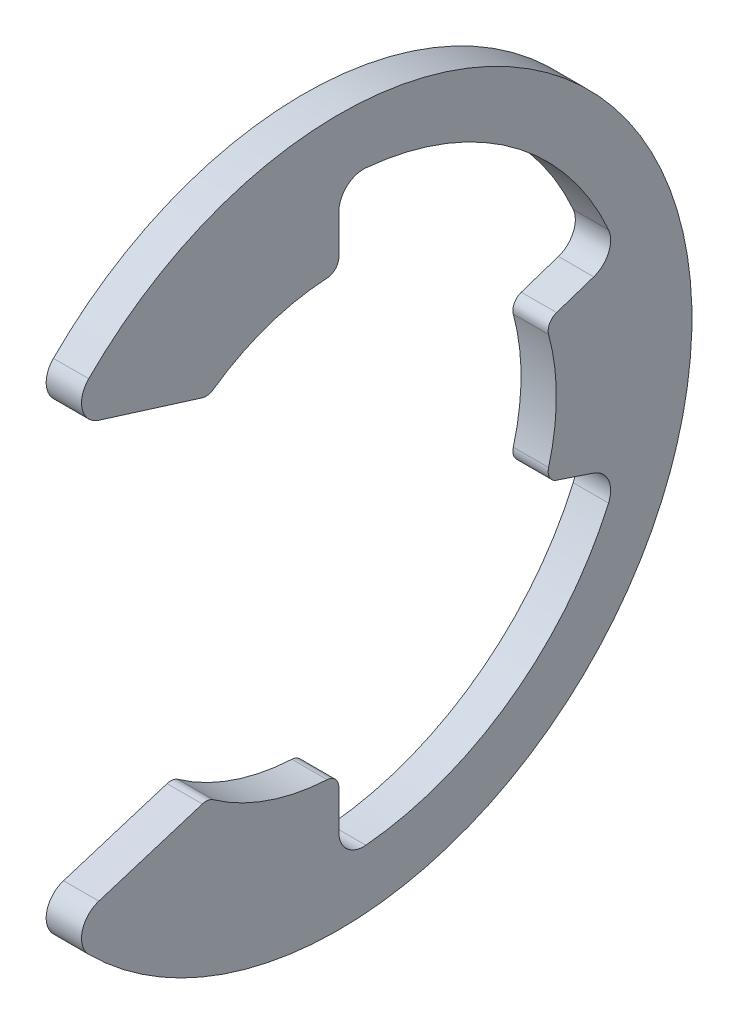
ISO-10303-21;
HEADER;
FILE_DESCRIPTION(('STEP AP214'),'2;1');
FILE_NAME('part.step','',(''),(''),'','','');
FILE_SCHEMA(('AUTOMOTIVE_DESIGN { 1 0 10303 214 1 1 1 1 }'));
ENDSEC;
DATA;
#1=APPLICATION_CONTEXT('core data for automotive mechanical design processes');
#2=APPLICATION_PROTOCOL_DEFINITION('international standard','automotive_design',2000,#1);
#3=PRODUCT_CONTEXT('',#1,'mechanical');
#4=PRODUCT('Part','Part','',(#3));
#5=PRODUCT_RELATED_PRODUCT_CATEGORY('part','',(#4));
#6=PRODUCT_DEFINITION_FORMATION('','',#4);
#7=PRODUCT_DEFINITION_CONTEXT('part definition',#1,'design');
#8=PRODUCT_DEFINITION('design','',#6,#7);
#9=PRODUCT_DEFINITION_SHAPE('','',#8);
#10=(LENGTH_UNIT() NAMED_UNIT(*) SI_UNIT(.MILLI.,.METRE.));
#11=(NAMED_UNIT(*) PLANE_ANGLE_UNIT() SI_UNIT($,.RADIAN.));
#12=(NAMED_UNIT(*) SI_UNIT($,.STERADIAN.) SOLID_ANGLE_UNIT());
#13=UNCERTAINTY_MEASURE_WITH_UNIT(LENGTH_MEASURE(1.E-05),#10,'distance_accuracy_value','');
#14=(GEOMETRIC_REPRESENTATION_CONTEXT(3) GLOBAL_UNCERTAINTY_ASSIGNED_CONTEXT((#13)) GLOBAL_UNIT_ASSIGNED_CONTEXT((#10,
#11,#12)) REPRESENTATION_CONTEXT('',''));
#15=CARTESIAN_POINT('',(0.,0.,0.));
#16=DIRECTION('',(0.,0.,1.));
#17=DIRECTION('',(1.,0.,0.));
#18=AXIS2_PLACEMENT_3D('',#15,#16,#17);
#19=CARTESIAN_POINT('',(0.634999999999999,0.,0.));
#20=DIRECTION('',(-1.,0.,0.));
#21=DIRECTION('',(0.,0.,1.));
#22=AXIS2_PLACEMENT_3D('',#19,#20,#21);
#23=CYLINDRICAL_SURFACE('',#22,7.8232);
#24=CARTESIAN_POINT('',(0.634999999999999,0.,0.));
#25=DIRECTION('',(-1.,0.,0.));
#26=DIRECTION('',(0.,0.,-1.));
#27=AXIS2_PLACEMENT_3D('',#24,#25,#26);
#28=CIRCLE('',#27,7.8232);
#29=CARTESIAN_POINT('',(0.634999999999999,2.0713168041031,-7.54401119677324));
#30=VERTEX_POINT('',#29);
#31=CARTESIAN_POINT('',(0.634999999999999,-2.0713168041031,-7.54401119677324));
#32=VERTEX_POINT('',#31);
#33=EDGE_CURVE('E241',#30,#32,#28,.T.);
#34=ORIENTED_EDGE('',*,*,#33,.F.);
#35=DIRECTION('',(-1.,0.,0.));
#36=VECTOR('',#35,1.);
#37=CARTESIAN_POINT('',(0.634999999999999,2.0713168041031,-7.54401119677324));
#38=LINE('',#37,#36);
#39=CARTESIAN_POINT('',(-0.635000000000002,2.0713168041031,-7.54401119677324));
#40=VERTEX_POINT('',#39);
#41=EDGE_CURVE('E355',#30,#40,#38,.T.);
#42=ORIENTED_EDGE('',*,*,#41,.T.);
#43=CARTESIAN_POINT('',(-0.635000000000002,0.,0.));
#44=DIRECTION('',(-1.,0.,0.));
#45=DIRECTION('',(0.,0.,-1.));
#46=AXIS2_PLACEMENT_3D('',#43,#44,#45);
#47=CIRCLE('',#46,7.8232);
#48=CARTESIAN_POINT('',(-0.635000000000002,-2.0713168041031,-7.54401119677324));
#49=VERTEX_POINT('',#48);
#50=EDGE_CURVE('E414',#40,#49,#47,.T.);
#51=ORIENTED_EDGE('',*,*,#50,.T.);
#52=DIRECTION('',(-1.,0.,0.));
#53=VECTOR('',#52,1.);
#54=CARTESIAN_POINT('',(0.634999999999999,-2.0713168041031,-7.54401119677324));
#55=LINE('',#54,#53);
#56=EDGE_CURVE('E55',#49,#32,#55,.F.);
#57=ORIENTED_EDGE('',*,*,#56,.T.);
#58=EDGE_LOOP('',(#34,#42,#51,#57));
#59=FACE_BOUND('',#58,.T.);
#60=ADVANCED_FACE('F32',(#59),#23,.F.);
#61=CARTESIAN_POINT('',(0.634999999999999,-2.47391305910293,-7.42173917730878));
#62=DIRECTION('',(0.,0.948683298050514,-0.316227766016838));
#63=DIRECTION('',(0.,0.316227766016838,0.948683298050514));
#64=AXIS2_PLACEMENT_3D('',#61,#62,#63);
#65=PLANE('',#64);
#66=DIRECTION('',(0.,-0.316227766016838,-0.948683298050514));
#67=VECTOR('',#66,1.);
#68=CARTESIAN_POINT('',(0.634999999999999,-2.47391305910293,-7.42173917730878));
#69=LINE('',#68,#67);
#70=CARTESIAN_POINT('',(0.634999999999999,-2.61069498486514,-7.83208495459542));
#71=VERTEX_POINT('',#70);
#72=CARTESIAN_POINT('',(0.634999999999999,-3.05564899135356,-9.16694697406069));
#73=VERTEX_POINT('',#72);
#74=EDGE_CURVE('E243',#71,#73,#69,.T.);
#75=ORIENTED_EDGE('',*,*,#74,.F.);
#76=DIRECTION('',(-1.,0.,0.));
#77=VECTOR('',#76,1.);
#78=CARTESIAN_POINT('',(0.634999999999999,-2.61069498486514,-7.83208495459542));
#79=LINE('',#78,#77);
#80=CARTESIAN_POINT('',(-0.635000000000002,-2.61069498486514,-7.83208495459542));
#81=VERTEX_POINT('',#80);
#82=EDGE_CURVE('E360',#71,#81,#79,.T.);
#83=ORIENTED_EDGE('',*,*,#82,.T.);
#84=DIRECTION('',(0.,-0.316227766016838,-0.948683298050514));
#85=VECTOR('',#84,1.);
#86=CARTESIAN_POINT('',(-0.635000000000002,-2.47391305910293,-7.42173917730878));
#87=LINE('',#86,#85);
#88=CARTESIAN_POINT('',(-0.635000000000002,-3.05564899135356,-9.16694697406069));
#89=VERTEX_POINT('',#88);
#90=EDGE_CURVE('E416',#81,#89,#87,.T.);
#91=ORIENTED_EDGE('',*,*,#90,.T.);
#92=DIRECTION('',(1.,0.,0.));
#93=VECTOR('',#92,1.);
#94=CARTESIAN_POINT('',(0.634999999999999,-3.05564899135356,-9.16694697406069));
#95=LINE('',#94,#93);
#96=EDGE_CURVE('E289',#89,#73,#95,.T.);
#97=ORIENTED_EDGE('',*,*,#96,.T.);
#98=EDGE_LOOP('',(#75,#83,#91,#97));
#99=FACE_BOUND('',#98,.T.);
#100=ADVANCED_FACE('F452',(#99),#65,.F.);
#101=CARTESIAN_POINT('',(0.634999999999999,0.,0.));
#102=DIRECTION('',(-1.,0.,0.));
#103=DIRECTION('',(0.,0.,1.));
#104=AXIS2_PLACEMENT_3D('',#101,#102,#103);
#105=CYLINDRICAL_SURFACE('',#104,10.5926193548387);
#106=CARTESIAN_POINT('',(-0.635000000000002,0.,0.));
#107=DIRECTION('',(-1.,0.,0.));
#108=DIRECTION('',(0.,0.,-1.));
#109=AXIS2_PLACEMENT_3D('',#106,#107,#108);
#110=CIRCLE('',#109,10.5926193548387);
#111=CARTESIAN_POINT('',(-0.635000000000002,-4.25623910455518,-9.69989760159142));
#112=VERTEX_POINT('',#111);
#113=CARTESIAN_POINT('',(-0.635000000000002,-10.548071831097,-0.970446001857637));
#114=VERTEX_POINT('',#113);
#115=EDGE_CURVE('E418',#112,#114,#110,.T.);
#116=ORIENTED_EDGE('',*,*,#115,.T.);
#117=DIRECTION('',(-1.,0.,0.));
#118=VECTOR('',#117,1.);
#119=CARTESIAN_POINT('',(0.634999999999999,-10.548071831097,-0.970446001857637));
#120=LINE('',#119,#118);
#121=CARTESIAN_POINT('',(0.634999999999999,-10.548071831097,-0.970446001857637));
#122=VERTEX_POINT('',#121);
#123=EDGE_CURVE('E287',#114,#122,#120,.F.);
#124=ORIENTED_EDGE('',*,*,#123,.T.);
#125=CARTESIAN_POINT('',(0.634999999999999,0.,0.));
#126=DIRECTION('',(-1.,0.,0.));
#127=DIRECTION('',(0.,0.,-1.));
#128=AXIS2_PLACEMENT_3D('',#125,#126,#127);
#129=CIRCLE('',#128,10.5926193548387);
#130=CARTESIAN_POINT('',(0.634999999999999,-4.25623910455518,-9.69989760159142));
#131=VERTEX_POINT('',#130);
#132=EDGE_CURVE('E245',#131,#122,#129,.T.);
#133=ORIENTED_EDGE('',*,*,#132,.F.);
#134=DIRECTION('',(-1.,0.,0.));
#135=VECTOR('',#134,1.);
#136=CARTESIAN_POINT('',(0.634999999999999,-4.25623910455518,-9.69989760159142));
#137=LINE('',#136,#135);
#138=EDGE_CURVE('E284',#131,#112,#137,.T.);
#139=ORIENTED_EDGE('',*,*,#138,.T.);
#140=EDGE_LOOP('',(#116,#124,#133,#139));
#141=FACE_BOUND('',#140,.T.);
#142=ADVANCED_FACE('F457',(#141),#105,.F.);
#143=CARTESIAN_POINT('',(0.634999999999999,-10.5926193548387,0.));
#144=DIRECTION('',(0.,0.,1.));
#145=DIRECTION('',(0.,-1.,0.));
#146=AXIS2_PLACEMENT_3D('',#143,#144,#145);
#147=PLANE('',#146);
#148=DIRECTION('',(0.,1.,0.));
#149=VECTOR('',#148,1.);
#150=CARTESIAN_POINT('',(-0.635000000000002,-10.5926193548387,0.));
#151=LINE('',#150,#149);
#152=CARTESIAN_POINT('',(-0.635000000000002,-9.66281054267341,0.));
#153=VERTEX_POINT('',#152);
#154=CARTESIAN_POINT('',(-0.635000000000002,-8.25574242815266,0.));
#155=VERTEX_POINT('',#154);
#156=EDGE_CURVE('E423',#153,#155,#151,.T.);
#157=ORIENTED_EDGE('',*,*,#156,.T.);
#158=DIRECTION('',(-1.,0.,0.));
#159=VECTOR('',#158,1.);
#160=CARTESIAN_POINT('',(0.634999999999999,-8.25574242815266,0.));
#161=LINE('',#160,#159);
#162=CARTESIAN_POINT('',(0.634999999999999,-8.25574242815266,0.));
#163=VERTEX_POINT('',#162);
#164=EDGE_CURVE('E338',#155,#163,#161,.F.);
#165=ORIENTED_EDGE('',*,*,#164,.T.);
#166=DIRECTION('',(0.,1.,0.));
#167=VECTOR('',#166,1.);
#168=CARTESIAN_POINT('',(0.634999999999999,-10.5926193548387,0.));
#169=LINE('',#168,#167);
#170=CARTESIAN_POINT('',(0.634999999999999,-9.66281054267341,0.));
#171=VERTEX_POINT('',#170);
#172=EDGE_CURVE('E248',#171,#163,#169,.T.);
#173=ORIENTED_EDGE('',*,*,#172,.F.);
#174=DIRECTION('',(1.,0.,0.));
#175=VECTOR('',#174,1.);
#176=CARTESIAN_POINT('',(-0.635000000000002,-9.66281054267341,0.));
#177=LINE('',#176,#175);
#178=EDGE_CURVE('E281',#171,#153,#177,.F.);
#179=ORIENTED_EDGE('',*,*,#178,.T.);
#180=EDGE_LOOP('',(#157,#165,#173,#179));
#181=FACE_BOUND('',#180,.T.);
#182=ADVANCED_FACE('F463',(#181),#147,.F.);
#183=CARTESIAN_POINT('',(0.634999999999999,0.,0.));
#184=DIRECTION('',(-1.,0.,0.));
#185=DIRECTION('',(0.,0.,1.));
#186=AXIS2_PLACEMENT_3D('',#183,#184,#185);
#187=CYLINDRICAL_SURFACE('',#186,7.8232);
#188=CARTESIAN_POINT('',(0.634999999999999,0.,0.));
#189=DIRECTION('',(-1.,0.,0.));
#190=DIRECTION('',(0.,0.,-1.));
#191=AXIS2_PLACEMENT_3D('',#188,#189,#190);
#192=CIRCLE('',#191,7.8232);
#193=CARTESIAN_POINT('',(0.634999999999999,-7.81188530835951,0.420602150537634));
#194=VERTEX_POINT('',#193);
#195=CARTESIAN_POINT('',(0.634999999999999,-6.38663695806226,4.51811095546725));
#196=VERTEX_POINT('',#195);
#197=EDGE_CURVE('E251',#194,#196,#192,.T.);
#198=ORIENTED_EDGE('',*,*,#197,.F.);
#199=DIRECTION('',(-1.,0.,0.));
#200=VECTOR('',#199,1.);
#201=CARTESIAN_POINT('',(0.634999999999999,-7.81188530835951,0.420602150537634));
#202=LINE('',#201,#200);
#203=CARTESIAN_POINT('',(-0.635000000000002,-7.81188530835951,0.420602150537634));
#204=VERTEX_POINT('',#203);
#205=EDGE_CURVE('E323',#194,#204,#202,.T.);
#206=ORIENTED_EDGE('',*,*,#205,.T.);
#207=CARTESIAN_POINT('',(-0.635000000000002,0.,0.));
#208=DIRECTION('',(-1.,0.,0.));
#209=DIRECTION('',(0.,0.,-1.));
#210=AXIS2_PLACEMENT_3D('',#207,#208,#209);
#211=CIRCLE('',#210,7.8232);
#212=CARTESIAN_POINT('',(-0.635000000000002,-6.38663695806226,4.51811095546725));
#213=VERTEX_POINT('',#212);
#214=EDGE_CURVE('E227',#204,#213,#211,.T.);
#215=ORIENTED_EDGE('',*,*,#214,.T.);
#216=DIRECTION('',(-1.,0.,0.));
#217=VECTOR('',#216,1.);
#218=CARTESIAN_POINT('',(0.634999999999999,-6.38663695806226,4.51811095546725));
#219=LINE('',#218,#217);
#220=EDGE_CURVE('E321',#213,#196,#219,.F.);
#221=ORIENTED_EDGE('',*,*,#220,.T.);
#222=EDGE_LOOP('',(#198,#206,#215,#221));
#223=FACE_BOUND('',#222,.T.);
#224=ADVANCED_FACE('F429',(#223),#187,.F.);
#225=CARTESIAN_POINT('',(0.634999999999999,-6.25856,4.69392));
#226=DIRECTION('',(0.,-0.954513538836348,-0.29816757734219));
#227=DIRECTION('',(0.,0.29816757734219,-0.954513538836348));
#228=AXIS2_PLACEMENT_3D('',#225,#226,#227);
#229=PLANE('',#228);
#230=DIRECTION('',(0.,-0.29816757734219,0.954513538836348));
#231=VECTOR('',#230,1.);
#232=CARTESIAN_POINT('',(0.634999999999999,-6.25856,4.69392));
#233=LINE('',#232,#231);
#234=CARTESIAN_POINT('',(0.634999999999999,-6.32523278993941,4.90735729333831));
#235=VERTEX_POINT('',#234);
#236=CARTESIAN_POINT('',(0.634999999999999,-7.4884940698254,8.6312653411305));
#237=VERTEX_POINT('',#236);
#238=EDGE_CURVE('E254',#235,#237,#233,.T.);
#239=ORIENTED_EDGE('',*,*,#238,.F.);
#240=DIRECTION('',(-1.,0.,0.));
#241=VECTOR('',#240,1.);
#242=CARTESIAN_POINT('',(0.634999999999999,-6.32523278993941,4.90735729333831));
#243=LINE('',#242,#241);
#244=CARTESIAN_POINT('',(-0.635000000000002,-6.32523278993941,4.90735729333831));
#245=VERTEX_POINT('',#244);
#246=EDGE_CURVE('E351',#235,#245,#243,.T.);
#247=ORIENTED_EDGE('',*,*,#246,.T.);
#248=DIRECTION('',(0.,-0.29816757734219,0.954513538836348));
#249=VECTOR('',#248,1.);
#250=CARTESIAN_POINT('',(-0.635000000000002,-6.25856,4.69392));
#251=LINE('',#250,#249);
#252=CARTESIAN_POINT('',(-0.635000000000002,-7.4884940698254,8.6312653411305));
#253=VERTEX_POINT('',#252);
#254=EDGE_CURVE('E222',#245,#253,#251,.T.);
#255=ORIENTED_EDGE('',*,*,#254,.T.);
#256=DIRECTION('',(-1.,0.,0.));
#257=VECTOR('',#256,1.);
#258=CARTESIAN_POINT('',(0.634999999999999,-7.4884940698254,8.6312653411305));
#259=LINE('',#258,#257);
#260=EDGE_CURVE('E202',#253,#237,#259,.F.);
#261=ORIENTED_EDGE('',*,*,#260,.T.);
#262=EDGE_LOOP('',(#239,#247,#255,#261));
#263=FACE_BOUND('',#262,.T.);
#264=ADVANCED_FACE('F437',(#263),#229,.F.);
#265=CARTESIAN_POINT('',(0.634999999999999,0.,0.));
#266=DIRECTION('',(-1.,0.,0.));
#267=DIRECTION('',(0.,0.,1.));
#268=AXIS2_PLACEMENT_3D('',#265,#266,#267);
#269=CYLINDRICAL_SURFACE('',#268,12.7);
#270=CARTESIAN_POINT('',(0.634999999999999,0.,0.));
#271=DIRECTION('',(1.,0.,0.));
#272=DIRECTION('',(0.,0.,-1.));
#273=AXIS2_PLACEMENT_3D('',#270,#271,#272);
#274=CIRCLE('',#273,12.7);
#275=CARTESIAN_POINT('',(0.634999999999999,-8.96457699553862,8.99590791921859));
#276=VERTEX_POINT('',#275);
#277=CARTESIAN_POINT('',(0.634999999999999,8.96457699553862,8.99590791921859));
#278=VERTEX_POINT('',#277);
#279=EDGE_CURVE('E215',#276,#278,#274,.T.);
#280=ORIENTED_EDGE('',*,*,#279,.F.);
#281=DIRECTION('',(-1.,0.,0.));
#282=VECTOR('',#281,1.);
#283=CARTESIAN_POINT('',(0.634999999999999,-8.96457699553862,8.99590791921859));
#284=LINE('',#283,#282);
#285=CARTESIAN_POINT('',(-0.635000000000002,-8.96457699553862,8.99590791921859));
#286=VERTEX_POINT('',#285);
#287=EDGE_CURVE('E200',#276,#286,#284,.T.);
#288=ORIENTED_EDGE('',*,*,#287,.T.);
#289=CARTESIAN_POINT('',(-0.635000000000002,0.,0.));
#290=DIRECTION('',(1.,0.,0.));
#291=DIRECTION('',(0.,0.,-1.));
#292=AXIS2_PLACEMENT_3D('',#289,#290,#291);
#293=CIRCLE('',#292,12.7);
#294=CARTESIAN_POINT('',(-0.635000000000002,8.96457699553862,8.99590791921859));
#295=VERTEX_POINT('',#294);
#296=EDGE_CURVE('E212',#286,#295,#293,.T.);
#297=ORIENTED_EDGE('',*,*,#296,.T.);
#298=DIRECTION('',(-1.,0.,0.));
#299=VECTOR('',#298,1.);
#300=CARTESIAN_POINT('',(0.634999999999999,8.96457699553862,8.99590791921859));
#301=LINE('',#300,#299);
#302=EDGE_CURVE('E216',#295,#278,#301,.F.);
#303=ORIENTED_EDGE('',*,*,#302,.T.);
#304=EDGE_LOOP('',(#280,#288,#297,#303));
#305=FACE_BOUND('',#304,.T.);
#306=ADVANCED_FACE('F211',(#305),#269,.T.);
#307=CARTESIAN_POINT('',(0.634999999999999,7.89880802052856,9.94478918101504));
#308=DIRECTION('',(0.,0.954513538836348,-0.298167577342191));
#309=DIRECTION('',(0.,0.298167577342191,0.954513538836348));
#310=AXIS2_PLACEMENT_3D('',#307,#308,#309);
#311=PLANE('',#310);
#312=DIRECTION('',(0.,-0.298167577342191,-0.954513538836348));
#313=VECTOR('',#312,1.);
#314=CARTESIAN_POINT('',(-0.635000000000002,7.89880802052856,9.94478918101504));
#315=LINE('',#314,#313);
#316=CARTESIAN_POINT('',(-0.635000000000002,7.48849406982541,8.63126534113049));
#317=VERTEX_POINT('',#316);
#318=CARTESIAN_POINT('',(-0.635000000000002,6.32523278993941,4.90735729333831));
#319=VERTEX_POINT('',#318);
#320=EDGE_CURVE('E221',#317,#319,#315,.T.);
#321=ORIENTED_EDGE('',*,*,#320,.T.);
#322=DIRECTION('',(-1.,0.,0.));
#323=VECTOR('',#322,1.);
#324=CARTESIAN_POINT('',(0.634999999999999,6.32523278993941,4.90735729333831));
#325=LINE('',#324,#323);
#326=CARTESIAN_POINT('',(0.634999999999999,6.32523278993941,4.90735729333831));
#327=VERTEX_POINT('',#326);
#328=EDGE_CURVE('E40',#319,#327,#325,.F.);
#329=ORIENTED_EDGE('',*,*,#328,.T.);
#330=DIRECTION('',(0.,-0.298167577342191,-0.954513538836348));
#331=VECTOR('',#330,1.);
#332=CARTESIAN_POINT('',(0.634999999999999,7.89880802052856,9.94478918101504));
#333=LINE('',#332,#331);
#334=CARTESIAN_POINT('',(0.634999999999999,7.48849406982541,8.63126534113049));
#335=VERTEX_POINT('',#334);
#336=EDGE_CURVE('E257',#335,#327,#333,.T.);
#337=ORIENTED_EDGE('',*,*,#336,.F.);
#338=DIRECTION('',(-1.,0.,0.));
#339=VECTOR('',#338,1.);
#340=CARTESIAN_POINT('',(0.634999999999999,7.48849406982541,8.63126534113049));
#341=LINE('',#340,#339);
#342=EDGE_CURVE('E278',#335,#317,#341,.T.);
#343=ORIENTED_EDGE('',*,*,#342,.T.);
#344=EDGE_LOOP('',(#321,#329,#337,#343));
#345=FACE_BOUND('',#344,.T.);
#346=ADVANCED_FACE('F370',(#345),#311,.F.);
#347=CARTESIAN_POINT('',(0.634999999999999,0.,0.));
#348=DIRECTION('',(-1.,0.,0.));
#349=DIRECTION('',(0.,0.,1.));
#350=AXIS2_PLACEMENT_3D('',#347,#348,#349);
#351=CYLINDRICAL_SURFACE('',#350,7.8232);
#352=CARTESIAN_POINT('',(0.634999999999999,0.,0.));
#353=DIRECTION('',(-1.,0.,0.));
#354=DIRECTION('',(0.,0.,-1.));
#355=AXIS2_PLACEMENT_3D('',#352,#353,#354);
#356=CIRCLE('',#355,7.8232);
#357=CARTESIAN_POINT('',(0.634999999999999,6.38663695806226,4.51811095546725));
#358=VERTEX_POINT('',#357);
#359=CARTESIAN_POINT('',(0.634999999999999,7.81188530835951,0.420602150537636));
#360=VERTEX_POINT('',#359);
#361=EDGE_CURVE('E260',#358,#360,#356,.T.);
#362=ORIENTED_EDGE('',*,*,#361,.F.);
#363=DIRECTION('',(-1.,0.,0.));
#364=VECTOR('',#363,1.);
#365=CARTESIAN_POINT('',(0.634999999999999,6.38663695806226,4.51811095546725));
#366=LINE('',#365,#364);
#367=CARTESIAN_POINT('',(-0.635000000000002,6.38663695806226,4.51811095546725));
#368=VERTEX_POINT('',#367);
#369=EDGE_CURVE('E365',#358,#368,#366,.T.);
#370=ORIENTED_EDGE('',*,*,#369,.T.);
#371=CARTESIAN_POINT('',(-0.635000000000002,0.,0.));
#372=DIRECTION('',(-1.,0.,0.));
#373=DIRECTION('',(0.,0.,-1.));
#374=AXIS2_PLACEMENT_3D('',#371,#372,#373);
#375=CIRCLE('',#374,7.8232);
#376=CARTESIAN_POINT('',(-0.635000000000002,7.81188530835951,0.420602150537636));
#377=VERTEX_POINT('',#376);
#378=EDGE_CURVE('E225',#368,#377,#375,.T.);
#379=ORIENTED_EDGE('',*,*,#378,.T.);
#380=DIRECTION('',(-1.,0.,0.));
#381=VECTOR('',#380,1.);
#382=CARTESIAN_POINT('',(0.634999999999999,7.81188530835951,0.420602150537636));
#383=LINE('',#382,#381);
#384=EDGE_CURVE('E363',#377,#360,#383,.F.);
#385=ORIENTED_EDGE('',*,*,#384,.T.);
#386=EDGE_LOOP('',(#362,#370,#379,#385));
#387=FACE_BOUND('',#386,.T.);
#388=ADVANCED_FACE('F381',(#387),#351,.F.);
#389=CARTESIAN_POINT('',(0.634999999999999,7.8232,0.));
#390=DIRECTION('',(0.,0.,1.));
#391=DIRECTION('',(0.,-1.,0.));
#392=AXIS2_PLACEMENT_3D('',#389,#390,#391);
#393=PLANE('',#392);
#394=DIRECTION('',(0.,1.,0.));
#395=VECTOR('',#394,1.);
#396=CARTESIAN_POINT('',(0.634999999999999,7.8232,0.));
#397=LINE('',#396,#395);
#398=CARTESIAN_POINT('',(0.634999999999999,8.25574242815266,0.));
#399=VERTEX_POINT('',#398);
#400=CARTESIAN_POINT('',(0.634999999999999,9.66281054267341,0.));
#401=VERTEX_POINT('',#400);
#402=EDGE_CURVE('E263',#399,#401,#397,.T.);
#403=ORIENTED_EDGE('',*,*,#402,.F.);
#404=DIRECTION('',(-1.,0.,0.));
#405=VECTOR('',#404,1.);
#406=CARTESIAN_POINT('',(0.634999999999999,8.25574242815266,0.));
#407=LINE('',#406,#405);
#408=CARTESIAN_POINT('',(-0.635000000000002,8.25574242815266,0.));
#409=VERTEX_POINT('',#408);
#410=EDGE_CURVE('E11',#399,#409,#407,.T.);
#411=ORIENTED_EDGE('',*,*,#410,.T.);
#412=DIRECTION('',(0.,1.,0.));
#413=VECTOR('',#412,1.);
#414=CARTESIAN_POINT('',(-0.635000000000002,7.8232,0.));
#415=LINE('',#414,#413);
#416=CARTESIAN_POINT('',(-0.635000000000002,9.66281054267341,0.));
#417=VERTEX_POINT('',#416);
#418=EDGE_CURVE('E233',#409,#417,#415,.T.);
#419=ORIENTED_EDGE('',*,*,#418,.T.);
#420=DIRECTION('',(1.,0.,0.));
#421=VECTOR('',#420,1.);
#422=CARTESIAN_POINT('',(0.634999999999999,9.66281054267341,0.));
#423=LINE('',#422,#421);
#424=EDGE_CURVE('E300',#417,#401,#423,.T.);
#425=ORIENTED_EDGE('',*,*,#424,.T.);
#426=EDGE_LOOP('',(#403,#411,#419,#425));
#427=FACE_BOUND('',#426,.T.);
#428=ADVANCED_FACE('F389',(#427),#393,.F.);
#429=CARTESIAN_POINT('',(0.634999999999999,0.,0.));
#430=DIRECTION('',(-1.,0.,0.));
#431=DIRECTION('',(0.,0.,1.));
#432=AXIS2_PLACEMENT_3D('',#429,#430,#431);
#433=CYLINDRICAL_SURFACE('',#432,10.5926193548387);
#434=CARTESIAN_POINT('',(-0.635000000000002,0.,0.));
#435=DIRECTION('',(-1.,0.,0.));
#436=DIRECTION('',(0.,0.,-1.));
#437=AXIS2_PLACEMENT_3D('',#434,#435,#436);
#438=CIRCLE('',#437,10.5926193548387);
#439=CARTESIAN_POINT('',(-0.635000000000002,10.548071831097,-0.970446001857636));
#440=VERTEX_POINT('',#439);
#441=CARTESIAN_POINT('',(-0.635000000000002,4.25623910455518,-9.69989760159141));
#442=VERTEX_POINT('',#441);
#443=EDGE_CURVE('E235',#440,#442,#438,.T.);
#444=ORIENTED_EDGE('',*,*,#443,.T.);
#445=DIRECTION('',(-1.,0.,0.));
#446=VECTOR('',#445,1.);
#447=CARTESIAN_POINT('',(0.634999999999999,4.25623910455518,-9.69989760159142));
#448=LINE('',#447,#446);
#449=CARTESIAN_POINT('',(0.634999999999999,4.25623910455518,-9.69989760159141));
#450=VERTEX_POINT('',#449);
#451=EDGE_CURVE('E298',#442,#450,#448,.F.);
#452=ORIENTED_EDGE('',*,*,#451,.T.);
#453=CARTESIAN_POINT('',(0.634999999999999,0.,0.));
#454=DIRECTION('',(-1.,0.,0.));
#455=DIRECTION('',(0.,0.,-1.));
#456=AXIS2_PLACEMENT_3D('',#453,#454,#455);
#457=CIRCLE('',#456,10.5926193548387);
#458=CARTESIAN_POINT('',(0.634999999999999,10.548071831097,-0.970446001857636));
#459=VERTEX_POINT('',#458);
#460=EDGE_CURVE('E265',#459,#450,#457,.T.);
#461=ORIENTED_EDGE('',*,*,#460,.F.);
#462=DIRECTION('',(-1.,0.,0.));
#463=VECTOR('',#462,1.);
#464=CARTESIAN_POINT('',(0.634999999999999,10.548071831097,-0.970446001857636));
#465=LINE('',#464,#463);
#466=EDGE_CURVE('E295',#459,#440,#465,.T.);
#467=ORIENTED_EDGE('',*,*,#466,.T.);
#468=EDGE_LOOP('',(#444,#452,#461,#467));
#469=FACE_BOUND('',#468,.T.);
#470=ADVANCED_FACE('F397',(#469),#433,.F.);
#471=CARTESIAN_POINT('',(0.634999999999999,3.34968035484737,-10.0490410645421));
#472=DIRECTION('',(0.,-0.948683298050514,-0.316227766016838));
#473=DIRECTION('',(0.,0.316227766016838,-0.948683298050514));
#474=AXIS2_PLACEMENT_3D('',#471,#472,#473);
#475=PLANE('',#474);
#476=DIRECTION('',(0.,-0.316227766016838,0.948683298050514));
#477=VECTOR('',#476,1.);
#478=CARTESIAN_POINT('',(-0.635000000000002,3.34968035484737,-10.0490410645421));
#479=LINE('',#478,#477);
#480=CARTESIAN_POINT('',(-0.635000000000002,3.05564899135356,-9.16694697406068));
#481=VERTEX_POINT('',#480);
#482=CARTESIAN_POINT('',(-0.635000000000002,2.61069498486514,-7.83208495459542));
#483=VERTEX_POINT('',#482);
#484=EDGE_CURVE('E238',#481,#483,#479,.T.);
#485=ORIENTED_EDGE('',*,*,#484,.T.);
#486=DIRECTION('',(-1.,0.,0.));
#487=VECTOR('',#486,1.);
#488=CARTESIAN_POINT('',(0.634999999999999,2.61069498486514,-7.83208495459542));
#489=LINE('',#488,#487);
#490=CARTESIAN_POINT('',(0.634999999999999,2.61069498486514,-7.83208495459542));
#491=VERTEX_POINT('',#490);
#492=EDGE_CURVE('E358',#483,#491,#489,.F.);
#493=ORIENTED_EDGE('',*,*,#492,.T.);
#494=DIRECTION('',(0.,-0.316227766016838,0.948683298050514));
#495=VECTOR('',#494,1.);
#496=CARTESIAN_POINT('',(0.634999999999999,3.34968035484737,-10.0490410645421));
#497=LINE('',#496,#495);
#498=CARTESIAN_POINT('',(0.634999999999999,3.05564899135356,-9.16694697406068));
#499=VERTEX_POINT('',#498);
#500=EDGE_CURVE('E268',#499,#491,#497,.T.);
#501=ORIENTED_EDGE('',*,*,#500,.F.);
#502=DIRECTION('',(1.,0.,0.));
#503=VECTOR('',#502,1.);
#504=CARTESIAN_POINT('',(-0.635000000000002,3.05564899135356,-9.16694697406068));
#505=LINE('',#504,#503);
#506=EDGE_CURVE('E292',#499,#481,#505,.F.);
#507=ORIENTED_EDGE('',*,*,#506,.T.);
#508=EDGE_LOOP('',(#485,#493,#501,#507));
#509=FACE_BOUND('',#508,.T.);
#510=ADVANCED_FACE('F408',(#509),#475,.F.);
#511=CARTESIAN_POINT('',(0.634999999999999,0.,0.));
#512=DIRECTION('',(1.,0.,0.));
#513=DIRECTION('',(0.,0.,-1.));
#514=AXIS2_PLACEMENT_3D('',#511,#512,#513);
#515=PLANE('',#514);
#516=ORIENTED_EDGE('',*,*,#172,.T.);
#517=CARTESIAN_POINT('',(0.634999999999999,-8.25574242815266,0.4445));
#518=DIRECTION('',(1.,0.,0.));
#519=DIRECTION('',(0.,0.,-1.));
#520=AXIS2_PLACEMENT_3D('',#517,#518,#519);
#521=CIRCLE('',#520,0.4445);
#522=EDGE_CURVE('E349',#163,#194,#521,.T.);
#523=ORIENTED_EDGE('',*,*,#522,.T.);
#524=ORIENTED_EDGE('',*,*,#197,.T.);
#525=CARTESIAN_POINT('',(0.634999999999999,-6.74951405795217,4.77482180520971));
#526=DIRECTION('',(1.,0.,0.));
#527=DIRECTION('',(0.,0.,-1.));
#528=AXIS2_PLACEMENT_3D('',#525,#526,#527);
#529=CIRCLE('',#528,0.4445);
#530=EDGE_CURVE('E347',#196,#235,#529,.T.);
#531=ORIENTED_EDGE('',*,*,#530,.T.);
#532=ORIENTED_EDGE('',*,*,#238,.T.);
#533=CARTESIAN_POINT('',(0.634999999999999,-8.33705660585092,8.36619436487329));
#534=DIRECTION('',(1.,0.,0.));
#535=DIRECTION('',(0.,0.,-1.));
#536=AXIS2_PLACEMENT_3D('',#533,#534,#535);
#537=CIRCLE('',#536,0.889);
#538=EDGE_CURVE('E276',#237,#276,#537,.T.);
#539=ORIENTED_EDGE('',*,*,#538,.T.);
#540=ORIENTED_EDGE('',*,*,#279,.T.);
#541=CARTESIAN_POINT('',(0.634999999999999,8.33705660585092,8.36619436487329));
#542=DIRECTION('',(1.,0.,0.));
#543=DIRECTION('',(0.,0.,-1.));
#544=AXIS2_PLACEMENT_3D('',#541,#542,#543);
#545=CIRCLE('',#544,0.889);
#546=EDGE_CURVE('E274',#278,#335,#545,.T.);
#547=ORIENTED_EDGE('',*,*,#546,.T.);
#548=ORIENTED_EDGE('',*,*,#336,.T.);
#549=CARTESIAN_POINT('',(0.634999999999999,6.74951405795216,4.77482180520971));
#550=DIRECTION('',(1.,0.,0.));
#551=DIRECTION('',(0.,0.,-1.));
#552=AXIS2_PLACEMENT_3D('',#549,#550,#551);
#553=CIRCLE('',#552,0.4445);
#554=EDGE_CURVE('E342',#327,#358,#553,.T.);
#555=ORIENTED_EDGE('',*,*,#554,.T.);
#556=ORIENTED_EDGE('',*,*,#361,.T.);
#557=CARTESIAN_POINT('',(0.634999999999999,8.25574242815266,0.444500000000001));
#558=DIRECTION('',(1.,0.,0.));
#559=DIRECTION('',(0.,0.,-1.));
#560=AXIS2_PLACEMENT_3D('',#557,#558,#559);
#561=CIRCLE('',#560,0.4445);
#562=EDGE_CURVE('E340',#360,#399,#561,.T.);
#563=ORIENTED_EDGE('',*,*,#562,.T.);
#564=ORIENTED_EDGE('',*,*,#402,.T.);
#565=CARTESIAN_POINT('',(0.634999999999999,9.66281054267341,-0.888999999999999));
#566=DIRECTION('',(1.,0.,0.));
#567=DIRECTION('',(0.,0.,-1.));
#568=AXIS2_PLACEMENT_3D('',#565,#566,#567);
#569=CIRCLE('',#568,0.889);
#570=EDGE_CURVE('E319',#401,#459,#569,.F.);
#571=ORIENTED_EDGE('',*,*,#570,.T.);
#572=ORIENTED_EDGE('',*,*,#460,.T.);
#573=CARTESIAN_POINT('',(0.634999999999999,3.89902844332047,-8.88582049007172));
#574=DIRECTION('',(1.,0.,0.));
#575=DIRECTION('',(0.,0.,-1.));
#576=AXIS2_PLACEMENT_3D('',#573,#574,#575);
#577=CIRCLE('',#576,0.889);
#578=EDGE_CURVE('E314',#450,#499,#577,.F.);
#579=ORIENTED_EDGE('',*,*,#578,.T.);
#580=ORIENTED_EDGE('',*,*,#500,.T.);
#581=CARTESIAN_POINT('',(0.634999999999999,2.18900525888169,-7.9726481965899));
#582=DIRECTION('',(1.,0.,0.));
#583=DIRECTION('',(0.,0.,-1.));
#584=AXIS2_PLACEMENT_3D('',#581,#582,#583);
#585=CIRCLE('',#584,0.4445);
#586=EDGE_CURVE('E345',#491,#30,#585,.T.);
#587=ORIENTED_EDGE('',*,*,#586,.T.);
#588=ORIENTED_EDGE('',*,*,#33,.T.);
#589=CARTESIAN_POINT('',(0.634999999999999,-2.18900525888169,-7.9726481965899));
#590=DIRECTION('',(1.,0.,0.));
#591=DIRECTION('',(0.,0.,-1.));
#592=AXIS2_PLACEMENT_3D('',#589,#590,#591);
#593=CIRCLE('',#592,0.4445);
#594=EDGE_CURVE('E47',#32,#71,#593,.T.);
#595=ORIENTED_EDGE('',*,*,#594,.T.);
#596=ORIENTED_EDGE('',*,*,#74,.T.);
#597=CARTESIAN_POINT('',(0.634999999999999,-3.89902844332047,-8.88582049007172));
#598=DIRECTION('',(1.,0.,0.));
#599=DIRECTION('',(0.,0.,-1.));
#600=AXIS2_PLACEMENT_3D('',#597,#598,#599);
#601=CIRCLE('',#600,0.889);
#602=EDGE_CURVE('E310',#73,#131,#601,.F.);
#603=ORIENTED_EDGE('',*,*,#602,.T.);
#604=ORIENTED_EDGE('',*,*,#132,.T.);
#605=CARTESIAN_POINT('',(0.634999999999999,-9.66281054267341,-0.888999999999999));
#606=DIRECTION('',(1.,0.,0.));
#607=DIRECTION('',(0.,0.,-1.));
#608=AXIS2_PLACEMENT_3D('',#605,#606,#607);
#609=CIRCLE('',#608,0.889);
#610=EDGE_CURVE('E305',#122,#171,#609,.F.);
#611=ORIENTED_EDGE('',*,*,#610,.T.);
#612=EDGE_LOOP('',(#516,#523,#524,#531,#532,#539,#540,#547,#548,#555,#556,#563,#564,#571,#572,
#579,#580,#587,#588,#595,#596,#603,#604,#611));
#613=FACE_BOUND('',#612,.T.);
#614=ADVANCED_FACE('F374',(#613),#515,.T.);
#615=CARTESIAN_POINT('',(-0.635000000000002,0.,0.));
#616=DIRECTION('',(1.,0.,0.));
#617=DIRECTION('',(0.,0.,-1.));
#618=AXIS2_PLACEMENT_3D('',#615,#616,#617);
#619=PLANE('',#618);
#620=ORIENTED_EDGE('',*,*,#214,.F.);
#621=CARTESIAN_POINT('',(-0.635000000000002,-8.25574242815266,0.4445));
#622=DIRECTION('',(1.,0.,0.));
#623=DIRECTION('',(0.,0.,-1.));
#624=AXIS2_PLACEMENT_3D('',#621,#622,#623);
#625=CIRCLE('',#624,0.4445);
#626=EDGE_CURVE('E336',#204,#155,#625,.F.);
#627=ORIENTED_EDGE('',*,*,#626,.T.);
#628=ORIENTED_EDGE('',*,*,#156,.F.);
#629=CARTESIAN_POINT('',(-0.635000000000002,-9.66281054267341,-0.888999999999999));
#630=DIRECTION('',(1.,0.,0.));
#631=DIRECTION('',(0.,0.,-1.));
#632=AXIS2_PLACEMENT_3D('',#629,#630,#631);
#633=CIRCLE('',#632,0.889);
#634=EDGE_CURVE('E303',#153,#114,#633,.T.);
#635=ORIENTED_EDGE('',*,*,#634,.T.);
#636=ORIENTED_EDGE('',*,*,#115,.F.);
#637=CARTESIAN_POINT('',(-0.635000000000002,-3.89902844332047,-8.88582049007172));
#638=DIRECTION('',(1.,0.,0.));
#639=DIRECTION('',(0.,0.,-1.));
#640=AXIS2_PLACEMENT_3D('',#637,#638,#639);
#641=CIRCLE('',#640,0.889);
#642=EDGE_CURVE('E307',#112,#89,#641,.T.);
#643=ORIENTED_EDGE('',*,*,#642,.T.);
#644=ORIENTED_EDGE('',*,*,#90,.F.);
#645=CARTESIAN_POINT('',(-0.635000000000002,-2.18900525888169,-7.9726481965899));
#646=DIRECTION('',(1.,0.,0.));
#647=DIRECTION('',(0.,0.,-1.));
#648=AXIS2_PLACEMENT_3D('',#645,#646,#647);
#649=CIRCLE('',#648,0.4445);
#650=EDGE_CURVE('E330',#81,#49,#649,.F.);
#651=ORIENTED_EDGE('',*,*,#650,.T.);
#652=ORIENTED_EDGE('',*,*,#50,.F.);
#653=CARTESIAN_POINT('',(-0.635000000000002,2.18900525888169,-7.9726481965899));
#654=DIRECTION('',(1.,0.,0.));
#655=DIRECTION('',(0.,0.,-1.));
#656=AXIS2_PLACEMENT_3D('',#653,#654,#655);
#657=CIRCLE('',#656,0.4445);
#658=EDGE_CURVE('E332',#40,#483,#657,.F.);
#659=ORIENTED_EDGE('',*,*,#658,.T.);
#660=ORIENTED_EDGE('',*,*,#484,.F.);
#661=CARTESIAN_POINT('',(-0.635000000000002,3.89902844332047,-8.88582049007172));
#662=DIRECTION('',(1.,0.,0.));
#663=DIRECTION('',(0.,0.,-1.));
#664=AXIS2_PLACEMENT_3D('',#661,#662,#663);
#665=CIRCLE('',#664,0.889);
#666=EDGE_CURVE('E312',#481,#442,#665,.T.);
#667=ORIENTED_EDGE('',*,*,#666,.T.);
#668=ORIENTED_EDGE('',*,*,#443,.F.);
#669=CARTESIAN_POINT('',(-0.635000000000002,9.66281054267341,-0.888999999999999));
#670=DIRECTION('',(1.,0.,0.));
#671=DIRECTION('',(0.,0.,-1.));
#672=AXIS2_PLACEMENT_3D('',#669,#670,#671);
#673=CIRCLE('',#672,0.889);
#674=EDGE_CURVE('E316',#440,#417,#673,.T.);
#675=ORIENTED_EDGE('',*,*,#674,.T.);
#676=ORIENTED_EDGE('',*,*,#418,.F.);
#677=CARTESIAN_POINT('',(-0.635000000000002,8.25574242815266,0.444500000000001));
#678=DIRECTION('',(1.,0.,0.));
#679=DIRECTION('',(0.,0.,-1.));
#680=AXIS2_PLACEMENT_3D('',#677,#678,#679);
#681=CIRCLE('',#680,0.4445);
#682=EDGE_CURVE('E326',#409,#377,#681,.F.);
#683=ORIENTED_EDGE('',*,*,#682,.T.);
#684=ORIENTED_EDGE('',*,*,#378,.F.);
#685=CARTESIAN_POINT('',(-0.635000000000002,6.74951405795216,4.77482180520971));
#686=DIRECTION('',(1.,0.,0.));
#687=DIRECTION('',(0.,0.,-1.));
#688=AXIS2_PLACEMENT_3D('',#685,#686,#687);
#689=CIRCLE('',#688,0.4445);
#690=EDGE_CURVE('E328',#368,#319,#689,.F.);
#691=ORIENTED_EDGE('',*,*,#690,.T.);
#692=ORIENTED_EDGE('',*,*,#320,.F.);
#693=CARTESIAN_POINT('',(-0.635000000000002,8.33705660585092,8.36619436487329));
#694=DIRECTION('',(1.,0.,0.));
#695=DIRECTION('',(0.,0.,-1.));
#696=AXIS2_PLACEMENT_3D('',#693,#694,#695);
#697=CIRCLE('',#696,0.889);
#698=EDGE_CURVE('E206',#317,#295,#697,.F.);
#699=ORIENTED_EDGE('',*,*,#698,.T.);
#700=ORIENTED_EDGE('',*,*,#296,.F.);
#701=CARTESIAN_POINT('',(-0.635000000000002,-8.33705660585092,8.36619436487329));
#702=DIRECTION('',(1.,0.,0.));
#703=DIRECTION('',(0.,0.,-1.));
#704=AXIS2_PLACEMENT_3D('',#701,#702,#703);
#705=CIRCLE('',#704,0.889);
#706=EDGE_CURVE('E196',#286,#253,#705,.F.);
#707=ORIENTED_EDGE('',*,*,#706,.T.);
#708=ORIENTED_EDGE('',*,*,#254,.F.);
#709=CARTESIAN_POINT('',(-0.635000000000002,-6.74951405795217,4.77482180520971));
#710=DIRECTION('',(1.,0.,0.));
#711=DIRECTION('',(0.,0.,-1.));
#712=AXIS2_PLACEMENT_3D('',#709,#710,#711);
#713=CIRCLE('',#712,0.4445);
#714=EDGE_CURVE('E334',#245,#213,#713,.F.);
#715=ORIENTED_EDGE('',*,*,#714,.T.);
#716=EDGE_LOOP('',(#620,#627,#628,#635,#636,#643,#644,#651,#652,#659,#660,#667,#668,#675,#676,
#683,#684,#691,#692,#699,#700,#707,#708,#715));
#717=FACE_BOUND('',#716,.T.);
#718=ADVANCED_FACE('F219',(#717),#619,.F.);
#719=CARTESIAN_POINT('',(0.634999999999999,-8.33705660585092,8.36619436487329));
#720=DIRECTION('',(-1.,0.,0.));
#721=DIRECTION('',(0.,0.,1.));
#722=AXIS2_PLACEMENT_3D('',#719,#720,#721);
#723=CYLINDRICAL_SURFACE('',#722,0.889);
#724=ORIENTED_EDGE('',*,*,#538,.F.);
#725=ORIENTED_EDGE('',*,*,#260,.F.);
#726=ORIENTED_EDGE('',*,*,#706,.F.);
#727=ORIENTED_EDGE('',*,*,#287,.F.);
#728=EDGE_LOOP('',(#724,#725,#726,#727));
#729=FACE_BOUND('',#728,.T.);
#730=ADVANCED_FACE('F199',(#729),#723,.T.);
#731=CARTESIAN_POINT('',(0.634999999999999,8.33705660585092,8.36619436487329));
#732=DIRECTION('',(-1.,0.,0.));
#733=DIRECTION('',(0.,0.,1.));
#734=AXIS2_PLACEMENT_3D('',#731,#732,#733);
#735=CYLINDRICAL_SURFACE('',#734,0.889);
#736=ORIENTED_EDGE('',*,*,#546,.F.);
#737=ORIENTED_EDGE('',*,*,#302,.F.);
#738=ORIENTED_EDGE('',*,*,#698,.F.);
#739=ORIENTED_EDGE('',*,*,#342,.F.);
#740=EDGE_LOOP('',(#736,#737,#738,#739));
#741=FACE_BOUND('',#740,.T.);
#742=ADVANCED_FACE('F439',(#741),#735,.T.);
#743=CARTESIAN_POINT('',(0.634999999999999,-9.66281054267341,-0.888999999999999));
#744=DIRECTION('',(-1.,0.,0.));
#745=DIRECTION('',(0.,0.,1.));
#746=AXIS2_PLACEMENT_3D('',#743,#744,#745);
#747=CYLINDRICAL_SURFACE('',#746,0.889);
#748=ORIENTED_EDGE('',*,*,#610,.F.);
#749=ORIENTED_EDGE('',*,*,#123,.F.);
#750=ORIENTED_EDGE('',*,*,#634,.F.);
#751=ORIENTED_EDGE('',*,*,#178,.F.);
#752=EDGE_LOOP('',(#748,#749,#750,#751));
#753=FACE_BOUND('',#752,.T.);
#754=ADVANCED_FACE('F441',(#753),#747,.F.);
#755=CARTESIAN_POINT('',(0.634999999999999,-3.89902844332047,-8.88582049007172));
#756=DIRECTION('',(-1.,0.,0.));
#757=DIRECTION('',(0.,0.,1.));
#758=AXIS2_PLACEMENT_3D('',#755,#756,#757);
#759=CYLINDRICAL_SURFACE('',#758,0.889);
#760=ORIENTED_EDGE('',*,*,#602,.F.);
#761=ORIENTED_EDGE('',*,*,#96,.F.);
#762=ORIENTED_EDGE('',*,*,#642,.F.);
#763=ORIENTED_EDGE('',*,*,#138,.F.);
#764=EDGE_LOOP('',(#760,#761,#762,#763));
#765=FACE_BOUND('',#764,.T.);
#766=ADVANCED_FACE('F447',(#765),#759,.F.);
#767=CARTESIAN_POINT('',(0.634999999999999,3.89902844332047,-8.88582049007172));
#768=DIRECTION('',(-1.,0.,0.));
#769=DIRECTION('',(0.,0.,1.));
#770=AXIS2_PLACEMENT_3D('',#767,#768,#769);
#771=CYLINDRICAL_SURFACE('',#770,0.889);
#772=ORIENTED_EDGE('',*,*,#578,.F.);
#773=ORIENTED_EDGE('',*,*,#451,.F.);
#774=ORIENTED_EDGE('',*,*,#666,.F.);
#775=ORIENTED_EDGE('',*,*,#506,.F.);
#776=EDGE_LOOP('',(#772,#773,#774,#775));
#777=FACE_BOUND('',#776,.T.);
#778=ADVANCED_FACE('F403',(#777),#771,.F.);
#779=CARTESIAN_POINT('',(0.634999999999999,9.66281054267341,-0.888999999999999));
#780=DIRECTION('',(-1.,0.,0.));
#781=DIRECTION('',(0.,0.,1.));
#782=AXIS2_PLACEMENT_3D('',#779,#780,#781);
#783=CYLINDRICAL_SURFACE('',#782,0.889);
#784=ORIENTED_EDGE('',*,*,#570,.F.);
#785=ORIENTED_EDGE('',*,*,#424,.F.);
#786=ORIENTED_EDGE('',*,*,#674,.F.);
#787=ORIENTED_EDGE('',*,*,#466,.F.);
#788=EDGE_LOOP('',(#784,#785,#786,#787));
#789=FACE_BOUND('',#788,.T.);
#790=ADVANCED_FACE('F400',(#789),#783,.F.);
#791=CARTESIAN_POINT('',(0.634999999999999,-8.25574242815266,0.4445));
#792=DIRECTION('',(-1.,0.,0.));
#793=DIRECTION('',(0.,0.,1.));
#794=AXIS2_PLACEMENT_3D('',#791,#792,#793);
#795=CYLINDRICAL_SURFACE('',#794,0.4445);
#796=ORIENTED_EDGE('',*,*,#522,.F.);
#797=ORIENTED_EDGE('',*,*,#164,.F.);
#798=ORIENTED_EDGE('',*,*,#626,.F.);
#799=ORIENTED_EDGE('',*,*,#205,.F.);
#800=EDGE_LOOP('',(#796,#797,#798,#799));
#801=FACE_BOUND('',#800,.T.);
#802=ADVANCED_FACE('F535',(#801),#795,.T.);
#803=CARTESIAN_POINT('',(0.634999999999999,-6.74951405795217,4.77482180520971));
#804=DIRECTION('',(-1.,0.,0.));
#805=DIRECTION('',(0.,0.,1.));
#806=AXIS2_PLACEMENT_3D('',#803,#804,#805);
#807=CYLINDRICAL_SURFACE('',#806,0.4445);
#808=ORIENTED_EDGE('',*,*,#530,.F.);
#809=ORIENTED_EDGE('',*,*,#220,.F.);
#810=ORIENTED_EDGE('',*,*,#714,.F.);
#811=ORIENTED_EDGE('',*,*,#246,.F.);
#812=EDGE_LOOP('',(#808,#809,#810,#811));
#813=FACE_BOUND('',#812,.T.);
#814=ADVANCED_FACE('F433',(#813),#807,.T.);
#815=CARTESIAN_POINT('',(0.634999999999999,2.18900525888169,-7.9726481965899));
#816=DIRECTION('',(-1.,0.,0.));
#817=DIRECTION('',(0.,0.,1.));
#818=AXIS2_PLACEMENT_3D('',#815,#816,#817);
#819=CYLINDRICAL_SURFACE('',#818,0.4445);
#820=ORIENTED_EDGE('',*,*,#586,.F.);
#821=ORIENTED_EDGE('',*,*,#492,.F.);
#822=ORIENTED_EDGE('',*,*,#658,.F.);
#823=ORIENTED_EDGE('',*,*,#41,.F.);
#824=EDGE_LOOP('',(#820,#821,#822,#823));
#825=FACE_BOUND('',#824,.T.);
#826=ADVANCED_FACE('F411',(#825),#819,.T.);
#827=CARTESIAN_POINT('',(0.634999999999999,-2.18900525888169,-7.9726481965899));
#828=DIRECTION('',(-1.,0.,0.));
#829=DIRECTION('',(0.,0.,1.));
#830=AXIS2_PLACEMENT_3D('',#827,#828,#829);
#831=CYLINDRICAL_SURFACE('',#830,0.4445);
#832=ORIENTED_EDGE('',*,*,#594,.F.);
#833=ORIENTED_EDGE('',*,*,#56,.F.);
#834=ORIENTED_EDGE('',*,*,#650,.F.);
#835=ORIENTED_EDGE('',*,*,#82,.F.);
#836=EDGE_LOOP('',(#832,#833,#834,#835));
#837=FACE_BOUND('',#836,.T.);
#838=ADVANCED_FACE('F628',(#837),#831,.T.);
#839=CARTESIAN_POINT('',(0.634999999999999,6.74951405795216,4.77482180520971));
#840=DIRECTION('',(-1.,0.,0.));
#841=DIRECTION('',(0.,0.,1.));
#842=AXIS2_PLACEMENT_3D('',#839,#840,#841);
#843=CYLINDRICAL_SURFACE('',#842,0.4445);
#844=ORIENTED_EDGE('',*,*,#554,.F.);
#845=ORIENTED_EDGE('',*,*,#328,.F.);
#846=ORIENTED_EDGE('',*,*,#690,.F.);
#847=ORIENTED_EDGE('',*,*,#369,.F.);
#848=EDGE_LOOP('',(#844,#845,#846,#847));
#849=FACE_BOUND('',#848,.T.);
#850=ADVANCED_FACE('F378',(#849),#843,.T.);
#851=CARTESIAN_POINT('',(0.634999999999999,8.25574242815266,0.444500000000001));
#852=DIRECTION('',(-1.,0.,0.));
#853=DIRECTION('',(0.,0.,1.));
#854=AXIS2_PLACEMENT_3D('',#851,#852,#853);
#855=CYLINDRICAL_SURFACE('',#854,0.4445);
#856=ORIENTED_EDGE('',*,*,#562,.F.);
#857=ORIENTED_EDGE('',*,*,#384,.F.);
#858=ORIENTED_EDGE('',*,*,#682,.F.);
#859=ORIENTED_EDGE('',*,*,#410,.F.);
#860=EDGE_LOOP('',(#856,#857,#858,#859));
#861=FACE_BOUND('',#860,.T.);
#862=ADVANCED_FACE('F34',(#861),#855,.T.);
#863=CLOSED_SHELL('',(#60,#100,#142,#182,#224,#264,#306,#346,#388,#428,#470,#510,#614,#718,#730,
#742,#754,#766,#778,#790,#802,#814,#826,#838,#850,#862));
#864=MANIFOLD_SOLID_BREP('B2',#863);
#865=ADVANCED_BREP_SHAPE_REPRESENTATION('',(#18,#864),#14);
#866=SHAPE_DEFINITION_REPRESENTATION(#9,#865);
ENDSEC;
END-ISO-10303-21;
